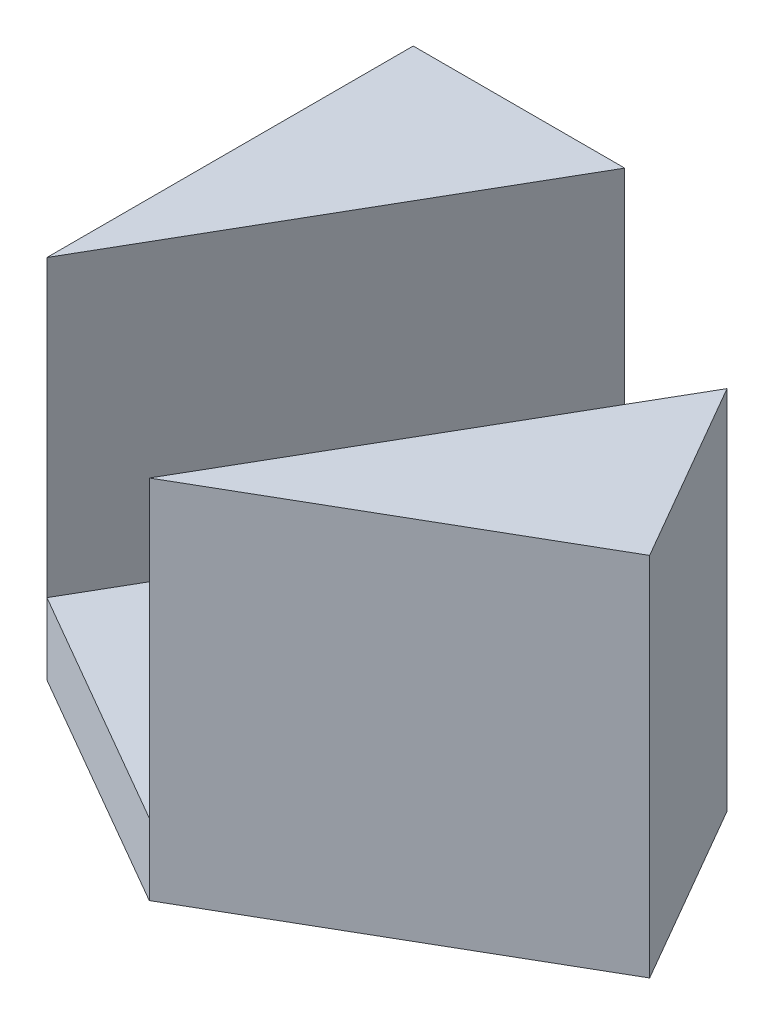
ISO-10303-21;
HEADER;
FILE_DESCRIPTION(('STEP AP214'),'2;1');
FILE_NAME('part.step','',(''),(''),'','','');
FILE_SCHEMA(('AUTOMOTIVE_DESIGN { 1 0 10303 214 1 1 1 1 }'));
ENDSEC;
DATA;
#1=APPLICATION_CONTEXT('core data for automotive mechanical design processes');
#2=APPLICATION_PROTOCOL_DEFINITION('international standard','automotive_design',2000,#1);
#3=PRODUCT_CONTEXT('',#1,'mechanical');
#4=PRODUCT('Part','Part','',(#3));
#5=PRODUCT_RELATED_PRODUCT_CATEGORY('part','',(#4));
#6=PRODUCT_DEFINITION_FORMATION('','',#4);
#7=PRODUCT_DEFINITION_CONTEXT('part definition',#1,'design');
#8=PRODUCT_DEFINITION('design','',#6,#7);
#9=PRODUCT_DEFINITION_SHAPE('','',#8);
#10=(LENGTH_UNIT() NAMED_UNIT(*) SI_UNIT(.MILLI.,.METRE.));
#11=(NAMED_UNIT(*) PLANE_ANGLE_UNIT() SI_UNIT($,.RADIAN.));
#12=(NAMED_UNIT(*) SI_UNIT($,.STERADIAN.) SOLID_ANGLE_UNIT());
#13=UNCERTAINTY_MEASURE_WITH_UNIT(LENGTH_MEASURE(1.E-05),#10,'distance_accuracy_value','');
#14=(GEOMETRIC_REPRESENTATION_CONTEXT(3) GLOBAL_UNCERTAINTY_ASSIGNED_CONTEXT((#13)) GLOBAL_UNIT_ASSIGNED_CONTEXT((#10,
#11,#12)) REPRESENTATION_CONTEXT('',''));
#15=CARTESIAN_POINT('',(0.,0.,0.));
#16=DIRECTION('',(0.,0.,1.));
#17=DIRECTION('',(1.,0.,0.));
#18=AXIS2_PLACEMENT_3D('',#15,#16,#17);
#19=CARTESIAN_POINT('',(-1.16240565691052E-13,15.38,-21.2673048453465));
#20=DIRECTION('',(0.,0.,-1.));
#21=DIRECTION('',(-1.,0.,0.));
#22=AXIS2_PLACEMENT_3D('',#19,#20,#21);
#23=PLANE('',#22);
#24=DIRECTION('',(1.,0.,0.));
#25=VECTOR('',#24,1.);
#26=CARTESIAN_POINT('',(-1.16240565691052E-13,0.,-21.2673048453465));
#27=LINE('',#26,#25);
#28=CARTESIAN_POINT('',(-118.536270398769,0.,-21.2673048453458));
#29=VERTEX_POINT('',#28);
#30=CARTESIAN_POINT('',(-109.649519052833,0.,-21.2673048453459));
#31=VERTEX_POINT('',#30);
#32=EDGE_CURVE('E123',#29,#31,#27,.T.);
#33=ORIENTED_EDGE('',*,*,#32,.F.);
#34=DIRECTION('',(0.,-1.,0.));
#35=VECTOR('',#34,1.);
#36=CARTESIAN_POINT('',(-118.536270398769,15.38,-21.2673048453458));
#37=LINE('',#36,#35);
#38=CARTESIAN_POINT('',(-118.536270398769,15.38,-21.2673048453458));
#39=VERTEX_POINT('',#38);
#40=EDGE_CURVE('E12',#39,#29,#37,.T.);
#41=ORIENTED_EDGE('',*,*,#40,.F.);
#42=DIRECTION('',(1.,0.,0.));
#43=VECTOR('',#42,1.);
#44=CARTESIAN_POINT('',(-1.16240565691052E-13,15.38,-21.2673048453465));
#45=LINE('',#44,#43);
#46=CARTESIAN_POINT('',(-109.649519052833,15.38,-21.2673048453459));
#47=VERTEX_POINT('',#46);
#48=EDGE_CURVE('E132',#39,#47,#45,.T.);
#49=ORIENTED_EDGE('',*,*,#48,.T.);
#50=DIRECTION('',(0.,-1.,0.));
#51=VECTOR('',#50,1.);
#52=CARTESIAN_POINT('',(-109.649519052833,15.38,-21.2673048453459));
#53=LINE('',#52,#51);
#54=CARTESIAN_POINT('',(-109.649519052833,3.,-21.2673048453459));
#55=VERTEX_POINT('',#54);
#56=EDGE_CURVE('E137',#47,#55,#53,.T.);
#57=ORIENTED_EDGE('',*,*,#56,.T.);
#58=DIRECTION('',(0.,-1.,0.));
#59=VECTOR('',#58,1.);
#60=CARTESIAN_POINT('',(-109.649519052833,3.,-21.2673048453459));
#61=LINE('',#60,#59);
#62=EDGE_CURVE('E128',#55,#31,#61,.T.);
#63=ORIENTED_EDGE('',*,*,#62,.T.);
#64=EDGE_LOOP('',(#33,#41,#49,#57,#63));
#65=FACE_BOUND('',#64,.T.);
#66=ADVANCED_FACE('F45',(#65),#23,.T.);
#67=CARTESIAN_POINT('',(-118.536270398769,15.38,0.));
#68=DIRECTION('',(1.,0.,0.));
#69=DIRECTION('',(0.,0.,-1.));
#70=AXIS2_PLACEMENT_3D('',#67,#68,#69);
#71=PLANE('',#70);
#72=DIRECTION('',(0.,0.,1.));
#73=VECTOR('',#72,1.);
#74=CARTESIAN_POINT('',(-118.536270398769,0.,0.));
#75=LINE('',#74,#73);
#76=CARTESIAN_POINT('',(-118.536270398769,0.,-5.87499999995279));
#77=VERTEX_POINT('',#76);
#78=EDGE_CURVE('E126',#29,#77,#75,.T.);
#79=ORIENTED_EDGE('',*,*,#78,.T.);
#80=DIRECTION('',(0.,-1.,0.));
#81=VECTOR('',#80,1.);
#82=CARTESIAN_POINT('',(-118.536270398769,3.,-5.87499999995279));
#83=LINE('',#82,#81);
#84=CARTESIAN_POINT('',(-118.536270398769,3.,-5.87499999995279));
#85=VERTEX_POINT('',#84);
#86=EDGE_CURVE('E104',#85,#77,#83,.T.);
#87=ORIENTED_EDGE('',*,*,#86,.F.);
#88=DIRECTION('',(0.,-1.,0.));
#89=VECTOR('',#88,1.);
#90=CARTESIAN_POINT('',(-118.536270398769,15.38,-5.87499999995279));
#91=LINE('',#90,#89);
#92=CARTESIAN_POINT('',(-118.536270398769,15.38,-5.87499999995279));
#93=VERTEX_POINT('',#92);
#94=EDGE_CURVE('E52',#93,#85,#91,.T.);
#95=ORIENTED_EDGE('',*,*,#94,.F.);
#96=DIRECTION('',(0.,0.,1.));
#97=VECTOR('',#96,1.);
#98=CARTESIAN_POINT('',(-118.536270398769,15.38,0.));
#99=LINE('',#98,#97);
#100=EDGE_CURVE('E135',#39,#93,#99,.T.);
#101=ORIENTED_EDGE('',*,*,#100,.F.);
#102=ORIENTED_EDGE('',*,*,#40,.T.);
#103=EDGE_LOOP('',(#79,#87,#95,#101,#102));
#104=FACE_BOUND('',#103,.T.);
#105=ADVANCED_FACE('F145',(#104),#71,.F.);
#106=CARTESIAN_POINT('',(-91.446152422673,15.38,-52.796460717586));
#107=DIRECTION('',(-0.866025403784438,0.,-0.500000000000002));
#108=DIRECTION('',(-0.500000000000002,0.,0.866025403784438));
#109=AXIS2_PLACEMENT_3D('',#106,#107,#108);
#110=PLANE('',#109);
#111=ORIENTED_EDGE('',*,*,#94,.T.);
#112=DIRECTION('',(0.500000000000002,0.,-0.866025403784438));
#113=VECTOR('',#112,1.);
#114=CARTESIAN_POINT('',(-91.446152422673,3.,-52.796460717586));
#115=LINE('',#114,#113);
#116=EDGE_CURVE('E118',#85,#55,#115,.T.);
#117=ORIENTED_EDGE('',*,*,#116,.T.);
#118=ORIENTED_EDGE('',*,*,#56,.F.);
#119=DIRECTION('',(0.500000000000002,0.,-0.866025403784438));
#120=VECTOR('',#119,1.);
#121=CARTESIAN_POINT('',(-91.446152422673,15.38,-52.796460717586));
#122=LINE('',#121,#120);
#123=EDGE_CURVE('E68',#93,#47,#122,.T.);
#124=ORIENTED_EDGE('',*,*,#123,.F.);
#125=EDGE_LOOP('',(#111,#117,#118,#124));
#126=FACE_BOUND('',#125,.T.);
#127=ADVANCED_FACE('F144',(#126),#110,.F.);
#128=CARTESIAN_POINT('',(0.,15.38,0.));
#129=DIRECTION('',(0.,1.,0.));
#130=DIRECTION('',(0.,0.,1.));
#131=AXIS2_PLACEMENT_3D('',#128,#129,#130);
#132=PLANE('',#131);
#133=ORIENTED_EDGE('',*,*,#48,.F.);
#134=ORIENTED_EDGE('',*,*,#100,.T.);
#135=ORIENTED_EDGE('',*,*,#123,.T.);
#136=EDGE_LOOP('',(#133,#134,#135));
#137=FACE_BOUND('',#136,.T.);
#138=ADVANCED_FACE('F162',(#137),#132,.T.);
#139=CARTESIAN_POINT('',(0.,0.,0.));
#140=DIRECTION('',(0.,1.,0.));
#141=DIRECTION('',(0.,0.,1.));
#142=AXIS2_PLACEMENT_3D('',#139,#140,#141);
#143=PLANE('',#142);
#144=ORIENTED_EDGE('',*,*,#32,.T.);
#145=DIRECTION('',(0.866025403784441,0.,0.499999999999997));
#146=VECTOR('',#145,1.);
#147=CARTESIAN_POINT('',(-18.2033666301591,0.,31.5291558722397));
#148=LINE('',#147,#146);
#149=CARTESIAN_POINT('',(-99.4737205583615,0.,-15.3923048453437));
#150=VERTEX_POINT('',#149);
#151=EDGE_CURVE('E119',#31,#150,#148,.T.);
#152=ORIENTED_EDGE('',*,*,#151,.T.);
#153=DIRECTION('',(0.499999999999994,0.,-0.866025403784443));
#154=VECTOR('',#153,1.);
#155=CARTESIAN_POINT('',(-81.2703539282027,0.,-46.9214607175832));
#156=LINE('',#155,#154);
#157=CARTESIAN_POINT('',(-108.360471904298,0.,4.94951302165703E-11));
#158=VERTEX_POINT('',#157);
#159=EDGE_CURVE('E152',#158,#150,#156,.T.);
#160=ORIENTED_EDGE('',*,*,#159,.F.);
#161=DIRECTION('',(0.86602540378444,0.,0.499999999999998));
#162=VECTOR('',#161,1.);
#163=CARTESIAN_POINT('',(-27.0901179760957,0.,46.9214607176329));
#164=LINE('',#163,#162);
#165=EDGE_CURVE('E122',#77,#158,#164,.T.);
#166=ORIENTED_EDGE('',*,*,#165,.F.);
#167=ORIENTED_EDGE('',*,*,#78,.F.);
#168=EDGE_LOOP('',(#144,#152,#160,#166,#167));
#169=FACE_BOUND('',#168,.T.);
#170=ADVANCED_FACE('F160',(#169),#143,.F.);
#171=CARTESIAN_POINT('',(-27.0901179760957,3.,46.9214607176329));
#172=DIRECTION('',(0.499999999999998,0.,-0.86602540378444));
#173=DIRECTION('',(-0.86602540378444,0.,-0.499999999999998));
#174=AXIS2_PLACEMENT_3D('',#171,#172,#173);
#175=PLANE('',#174);
#176=ORIENTED_EDGE('',*,*,#165,.T.);
#177=DIRECTION('',(0.,-1.,0.));
#178=VECTOR('',#177,1.);
#179=CARTESIAN_POINT('',(-108.360471904298,3.,4.94951302165703E-11));
#180=LINE('',#179,#178);
#181=CARTESIAN_POINT('',(-108.360471904298,3.,4.94951302165703E-11));
#182=VERTEX_POINT('',#181);
#183=EDGE_CURVE('E113',#182,#158,#180,.T.);
#184=ORIENTED_EDGE('',*,*,#183,.F.);
#185=DIRECTION('',(0.86602540378444,0.,0.499999999999998));
#186=VECTOR('',#185,1.);
#187=CARTESIAN_POINT('',(-27.0901179760957,3.,46.9214607176329));
#188=LINE('',#187,#186);
#189=EDGE_CURVE('E87',#85,#182,#188,.T.);
#190=ORIENTED_EDGE('',*,*,#189,.F.);
#191=ORIENTED_EDGE('',*,*,#86,.T.);
#192=EDGE_LOOP('',(#176,#184,#190,#191));
#193=FACE_BOUND('',#192,.T.);
#194=ADVANCED_FACE('F121',(#193),#175,.F.);
#195=CARTESIAN_POINT('',(-81.2703539282027,3.,-46.9214607175832));
#196=DIRECTION('',(-0.866025403784442,0.,-0.499999999999993));
#197=DIRECTION('',(-0.499999999999993,0.,0.866025403784442));
#198=AXIS2_PLACEMENT_3D('',#195,#196,#197);
#199=PLANE('',#198);
#200=ORIENTED_EDGE('',*,*,#159,.T.);
#201=DIRECTION('',(0.,-1.,0.));
#202=VECTOR('',#201,1.);
#203=CARTESIAN_POINT('',(-99.4737205583615,3.,-15.3923048453437));
#204=LINE('',#203,#202);
#205=CARTESIAN_POINT('',(-99.4737205583615,3.,-15.3923048453437));
#206=VERTEX_POINT('',#205);
#207=EDGE_CURVE('E114',#206,#150,#204,.T.);
#208=ORIENTED_EDGE('',*,*,#207,.F.);
#209=DIRECTION('',(0.499999999999994,0.,-0.866025403784443));
#210=VECTOR('',#209,1.);
#211=CARTESIAN_POINT('',(-81.2703539282027,3.,-46.9214607175832));
#212=LINE('',#211,#210);
#213=EDGE_CURVE('E110',#182,#206,#212,.T.);
#214=ORIENTED_EDGE('',*,*,#213,.F.);
#215=ORIENTED_EDGE('',*,*,#183,.T.);
#216=EDGE_LOOP('',(#200,#208,#214,#215));
#217=FACE_BOUND('',#216,.T.);
#218=ADVANCED_FACE('F112',(#217),#199,.F.);
#219=CARTESIAN_POINT('',(-18.2033666301591,3.,31.5291558722397));
#220=DIRECTION('',(0.499999999999997,0.,-0.866025403784441));
#221=DIRECTION('',(-0.866025403784441,0.,-0.499999999999997));
#222=AXIS2_PLACEMENT_3D('',#219,#220,#221);
#223=PLANE('',#222);
#224=ORIENTED_EDGE('',*,*,#151,.F.);
#225=ORIENTED_EDGE('',*,*,#62,.F.);
#226=DIRECTION('',(0.866025403784441,0.,0.499999999999997));
#227=VECTOR('',#226,1.);
#228=CARTESIAN_POINT('',(-18.2033666301591,3.,31.5291558722397));
#229=LINE('',#228,#227);
#230=EDGE_CURVE('E59',#55,#206,#229,.T.);
#231=ORIENTED_EDGE('',*,*,#230,.T.);
#232=ORIENTED_EDGE('',*,*,#207,.T.);
#233=EDGE_LOOP('',(#224,#225,#231,#232));
#234=FACE_BOUND('',#233,.T.);
#235=ADVANCED_FACE('F156',(#234),#223,.T.);
#236=CARTESIAN_POINT('',(0.,3.,0.));
#237=DIRECTION('',(0.,1.,0.));
#238=DIRECTION('',(0.,0.,1.));
#239=AXIS2_PLACEMENT_3D('',#236,#237,#238);
#240=PLANE('',#239);
#241=ORIENTED_EDGE('',*,*,#189,.T.);
#242=ORIENTED_EDGE('',*,*,#213,.T.);
#243=ORIENTED_EDGE('',*,*,#230,.F.);
#244=ORIENTED_EDGE('',*,*,#116,.F.);
#245=EDGE_LOOP('',(#241,#242,#243,#244));
#246=FACE_BOUND('',#245,.T.);
#247=ADVANCED_FACE('F116',(#246),#240,.T.);
#248=CLOSED_SHELL('',(#66,#105,#127,#138,#170,#194,#218,#235,#247));
#249=MANIFOLD_SOLID_BREP('B2',#248);
#250=CARTESIAN_POINT('',(-81.2703539282027,15.38,-46.9214607175832));
#251=DIRECTION('',(-0.866025403784442,0.,-0.499999999999994));
#252=DIRECTION('',(-0.499999999999994,0.,0.866025403784442));
#253=AXIS2_PLACEMENT_3D('',#250,#251,#252);
#254=PLANE('',#253);
#255=DIRECTION('',(0.499999999999994,0.,-0.866025403784443));
#256=VECTOR('',#255,1.);
#257=CARTESIAN_POINT('',(-81.2703539282027,0.,-46.9214607175832));
#258=LINE('',#257,#256);
#259=CARTESIAN_POINT('',(-108.360471904298,0.,4.94951302165703E-11));
#260=VERTEX_POINT('',#259);
#261=CARTESIAN_POINT('',(-99.4737205583615,0.,-15.3923048453437));
#262=VERTEX_POINT('',#261);
#263=EDGE_CURVE('E278',#260,#262,#258,.T.);
#264=ORIENTED_EDGE('',*,*,#263,.F.);
#265=DIRECTION('',(0.,-1.,0.));
#266=VECTOR('',#265,1.);
#267=CARTESIAN_POINT('',(-108.360471904298,15.38,4.94951302165703E-11));
#268=LINE('',#267,#266);
#269=CARTESIAN_POINT('',(-108.360471904298,15.38,4.94951302165703E-11));
#270=VERTEX_POINT('',#269);
#271=EDGE_CURVE('E43',#270,#260,#268,.T.);
#272=ORIENTED_EDGE('',*,*,#271,.F.);
#273=DIRECTION('',(0.499999999999994,0.,-0.866025403784443));
#274=VECTOR('',#273,1.);
#275=CARTESIAN_POINT('',(-81.2703539282027,15.38,-46.9214607175832));
#276=LINE('',#275,#274);
#277=CARTESIAN_POINT('',(-99.4737205583615,15.38,-15.3923048453437));
#278=VERTEX_POINT('',#277);
#279=EDGE_CURVE('E276',#270,#278,#276,.T.);
#280=ORIENTED_EDGE('',*,*,#279,.T.);
#281=DIRECTION('',(0.,-1.,0.));
#282=VECTOR('',#281,1.);
#283=CARTESIAN_POINT('',(-99.4737205583615,15.38,-15.3923048453437));
#284=LINE('',#283,#282);
#285=EDGE_CURVE('E272',#278,#262,#284,.T.);
#286=ORIENTED_EDGE('',*,*,#285,.T.);
#287=EDGE_LOOP('',(#264,#272,#280,#286));
#288=FACE_BOUND('',#287,.T.);
#289=ADVANCED_FACE('F238',(#288),#254,.T.);
#290=CARTESIAN_POINT('',(-27.0901179760534,15.38,-46.921460717559));
#291=DIRECTION('',(-0.500000000000003,0.,-0.866025403784437));
#292=DIRECTION('',(-0.866025403784437,0.,0.500000000000003));
#293=AXIS2_PLACEMENT_3D('',#290,#291,#292);
#294=PLANE('',#293);
#295=DIRECTION('',(0.866025403784437,0.,-0.500000000000003));
#296=VECTOR('',#295,1.);
#297=CARTESIAN_POINT('',(-27.0901179760534,0.,-46.921460717559));
#298=LINE('',#297,#296);
#299=CARTESIAN_POINT('',(-95.0303448853933,0.,-7.6961524226471));
#300=VERTEX_POINT('',#299);
#301=EDGE_CURVE('E266',#260,#300,#298,.T.);
#302=ORIENTED_EDGE('',*,*,#301,.T.);
#303=DIRECTION('',(0.,-1.,0.));
#304=VECTOR('',#303,1.);
#305=CARTESIAN_POINT('',(-95.0303448853933,15.38,-7.6961524226471));
#306=LINE('',#305,#304);
#307=CARTESIAN_POINT('',(-95.0303448853933,15.38,-7.6961524226471));
#308=VERTEX_POINT('',#307);
#309=EDGE_CURVE('E246',#308,#300,#306,.T.);
#310=ORIENTED_EDGE('',*,*,#309,.F.);
#311=DIRECTION('',(0.866025403784437,0.,-0.500000000000003));
#312=VECTOR('',#311,1.);
#313=CARTESIAN_POINT('',(-27.0901179760534,15.38,-46.921460717559));
#314=LINE('',#313,#312);
#315=EDGE_CURVE('E279',#270,#308,#314,.T.);
#316=ORIENTED_EDGE('',*,*,#315,.F.);
#317=ORIENTED_EDGE('',*,*,#271,.T.);
#318=EDGE_LOOP('',(#302,#310,#316,#317));
#319=FACE_BOUND('',#318,.T.);
#320=ADVANCED_FACE('F280',(#319),#294,.F.);
#321=CARTESIAN_POINT('',(-67.9402269093402,15.38,39.2253082949118));
#322=DIRECTION('',(-0.866025403784439,0.,0.5));
#323=DIRECTION('',(0.5,0.,0.866025403784439));
#324=AXIS2_PLACEMENT_3D('',#321,#322,#323);
#325=PLANE('',#324);
#326=DIRECTION('',(-0.5,0.,-0.866025403784439));
#327=VECTOR('',#326,1.);
#328=CARTESIAN_POINT('',(-67.9402269093402,0.,39.2253082949118));
#329=LINE('',#328,#327);
#330=EDGE_CURVE('E283',#300,#262,#329,.T.);
#331=ORIENTED_EDGE('',*,*,#330,.T.);
#332=ORIENTED_EDGE('',*,*,#285,.F.);
#333=DIRECTION('',(-0.5,0.,-0.866025403784439));
#334=VECTOR('',#333,1.);
#335=CARTESIAN_POINT('',(-67.9402269093402,15.38,39.2253082949118));
#336=LINE('',#335,#334);
#337=EDGE_CURVE('E254',#308,#278,#336,.T.);
#338=ORIENTED_EDGE('',*,*,#337,.F.);
#339=ORIENTED_EDGE('',*,*,#309,.T.);
#340=EDGE_LOOP('',(#331,#332,#338,#339));
#341=FACE_BOUND('',#340,.T.);
#342=ADVANCED_FACE('F292',(#341),#325,.F.);
#343=CARTESIAN_POINT('',(0.,15.38,0.));
#344=DIRECTION('',(0.,1.,0.));
#345=DIRECTION('',(0.,0.,1.));
#346=AXIS2_PLACEMENT_3D('',#343,#344,#345);
#347=PLANE('',#346);
#348=ORIENTED_EDGE('',*,*,#279,.F.);
#349=ORIENTED_EDGE('',*,*,#315,.T.);
#350=ORIENTED_EDGE('',*,*,#337,.T.);
#351=EDGE_LOOP('',(#348,#349,#350));
#352=FACE_BOUND('',#351,.T.);
#353=ADVANCED_FACE('F282',(#352),#347,.T.);
#354=CARTESIAN_POINT('',(0.,0.,0.));
#355=DIRECTION('',(0.,1.,0.));
#356=DIRECTION('',(0.,0.,1.));
#357=AXIS2_PLACEMENT_3D('',#354,#355,#356);
#358=PLANE('',#357);
#359=ORIENTED_EDGE('',*,*,#263,.T.);
#360=ORIENTED_EDGE('',*,*,#330,.F.);
#361=ORIENTED_EDGE('',*,*,#301,.F.);
#362=EDGE_LOOP('',(#359,#360,#361));
#363=FACE_BOUND('',#362,.T.);
#364=ADVANCED_FACE('F294',(#363),#358,.F.);
#365=CLOSED_SHELL('',(#289,#320,#342,#353,#364));
#366=MANIFOLD_SOLID_BREP('B6',#365);
#367=ADVANCED_BREP_SHAPE_REPRESENTATION('',(#18,#249,#366),#14);
#368=SHAPE_DEFINITION_REPRESENTATION(#9,#367);
ENDSEC;
END-ISO-10303-21;
